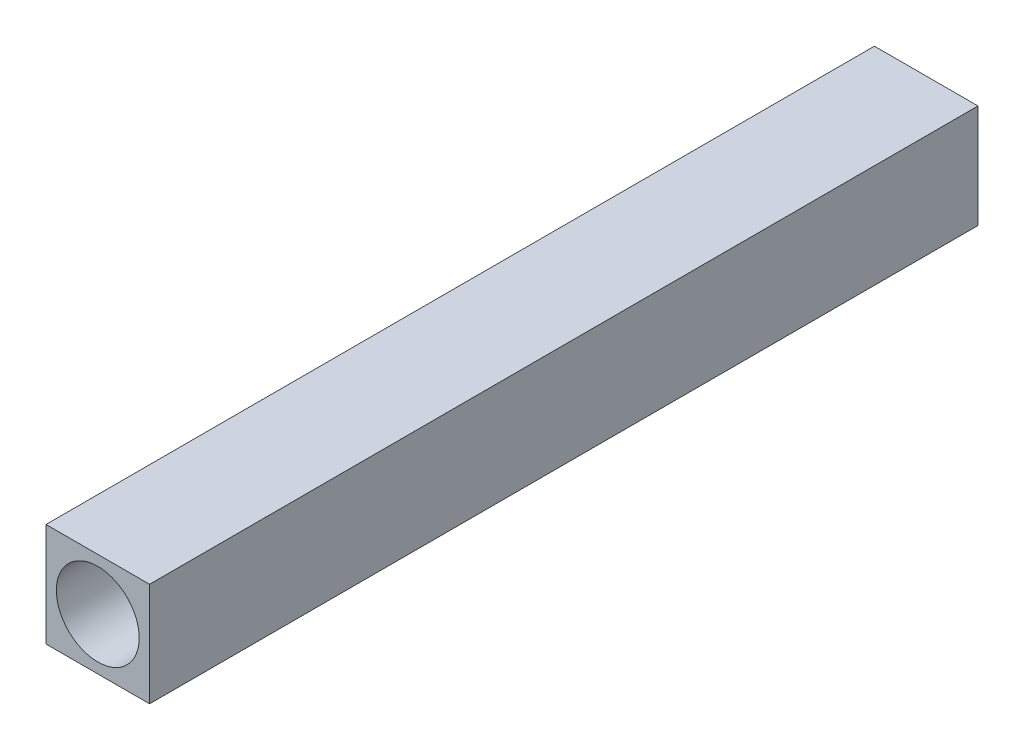
ISO-10303-21;
HEADER;
FILE_DESCRIPTION(('STEP AP214'),'2;1');
FILE_NAME('part.step','',(''),(''),'','','');
FILE_SCHEMA(('AUTOMOTIVE_DESIGN { 1 0 10303 214 1 1 1 1 }'));
ENDSEC;
DATA;
#1=APPLICATION_CONTEXT('core data for automotive mechanical design processes');
#2=APPLICATION_PROTOCOL_DEFINITION('international standard','automotive_design',2000,#1);
#3=PRODUCT_CONTEXT('',#1,'mechanical');
#4=PRODUCT('Part','Part','',(#3));
#5=PRODUCT_RELATED_PRODUCT_CATEGORY('part','',(#4));
#6=PRODUCT_DEFINITION_FORMATION('','',#4);
#7=PRODUCT_DEFINITION_CONTEXT('part definition',#1,'design');
#8=PRODUCT_DEFINITION('design','',#6,#7);
#9=PRODUCT_DEFINITION_SHAPE('','',#8);
#10=(LENGTH_UNIT() NAMED_UNIT(*) SI_UNIT(.MILLI.,.METRE.));
#11=(NAMED_UNIT(*) PLANE_ANGLE_UNIT() SI_UNIT($,.RADIAN.));
#12=(NAMED_UNIT(*) SI_UNIT($,.STERADIAN.) SOLID_ANGLE_UNIT());
#13=UNCERTAINTY_MEASURE_WITH_UNIT(LENGTH_MEASURE(1.E-05),#10,'distance_accuracy_value','');
#14=(GEOMETRIC_REPRESENTATION_CONTEXT(3) GLOBAL_UNCERTAINTY_ASSIGNED_CONTEXT((#13)) GLOBAL_UNIT_ASSIGNED_CONTEXT((#10,
#11,#12)) REPRESENTATION_CONTEXT('',''));
#15=CARTESIAN_POINT('',(0.,0.,0.));
#16=DIRECTION('',(0.,0.,1.));
#17=DIRECTION('',(1.,0.,0.));
#18=AXIS2_PLACEMENT_3D('',#15,#16,#17);
#19=CARTESIAN_POINT('',(0.,0.,100.));
#20=DIRECTION('',(0.,0.,-1.));
#21=DIRECTION('',(-1.,0.,0.));
#22=AXIS2_PLACEMENT_3D('',#19,#20,#21);
#23=PLANE('',#22);
#24=DIRECTION('',(0.,1.,0.));
#25=VECTOR('',#24,1.);
#26=CARTESIAN_POINT('',(12.5,-12.5,100.));
#27=LINE('',#26,#25);
#28=CARTESIAN_POINT('',(12.5,-12.5,100.));
#29=VERTEX_POINT('',#28);
#30=CARTESIAN_POINT('',(12.5,12.5,100.));
#31=VERTEX_POINT('',#30);
#32=EDGE_CURVE('E93',#29,#31,#27,.T.);
#33=ORIENTED_EDGE('',*,*,#32,.T.);
#34=DIRECTION('',(-1.,0.,0.));
#35=VECTOR('',#34,1.);
#36=CARTESIAN_POINT('',(-12.5,12.5,100.));
#37=LINE('',#36,#35);
#38=CARTESIAN_POINT('',(-12.5,12.5,100.));
#39=VERTEX_POINT('',#38);
#40=EDGE_CURVE('E87',#31,#39,#37,.T.);
#41=ORIENTED_EDGE('',*,*,#40,.T.);
#42=DIRECTION('',(0.,-1.,0.));
#43=VECTOR('',#42,1.);
#44=CARTESIAN_POINT('',(-12.5,-12.5,100.));
#45=LINE('',#44,#43);
#46=CARTESIAN_POINT('',(-12.5,-12.5,100.));
#47=VERTEX_POINT('',#46);
#48=EDGE_CURVE('E86',#39,#47,#45,.T.);
#49=ORIENTED_EDGE('',*,*,#48,.T.);
#50=DIRECTION('',(1.,0.,0.));
#51=VECTOR('',#50,1.);
#52=CARTESIAN_POINT('',(-12.5,-12.5,100.));
#53=LINE('',#52,#51);
#54=EDGE_CURVE('E57',#47,#29,#53,.T.);
#55=ORIENTED_EDGE('',*,*,#54,.T.);
#56=EDGE_LOOP('',(#33,#41,#49,#55));
#57=FACE_BOUND('',#56,.T.);
#58=CARTESIAN_POINT('',(0.,0.,100.));
#59=DIRECTION('',(0.,0.,1.));
#60=DIRECTION('',(1.,0.,0.));
#61=AXIS2_PLACEMENT_3D('',#58,#59,#60);
#62=CIRCLE('',#61,10.);
#63=CARTESIAN_POINT('',(10.,0.,100.));
#64=VERTEX_POINT('',#63);
#65=EDGE_CURVE('E108',#64,#64,#62,.T.);
#66=ORIENTED_EDGE('',*,*,#65,.F.);
#67=EDGE_LOOP('',(#66));
#68=FACE_BOUND('',#67,.T.);
#69=ADVANCED_FACE('F39',(#57,#68),#23,.F.);
#70=CARTESIAN_POINT('',(0.,0.,-100.));
#71=DIRECTION('',(0.,0.,-1.));
#72=DIRECTION('',(-1.,0.,0.));
#73=AXIS2_PLACEMENT_3D('',#70,#71,#72);
#74=PLANE('',#73);
#75=DIRECTION('',(0.,1.,0.));
#76=VECTOR('',#75,1.);
#77=CARTESIAN_POINT('',(12.5,-12.5,-100.));
#78=LINE('',#77,#76);
#79=CARTESIAN_POINT('',(12.5,-12.5,-100.));
#80=VERTEX_POINT('',#79);
#81=CARTESIAN_POINT('',(12.5,12.5,-100.));
#82=VERTEX_POINT('',#81);
#83=EDGE_CURVE('E105',#80,#82,#78,.T.);
#84=ORIENTED_EDGE('',*,*,#83,.F.);
#85=DIRECTION('',(1.,0.,0.));
#86=VECTOR('',#85,1.);
#87=CARTESIAN_POINT('',(-12.5,-12.5,-100.));
#88=LINE('',#87,#86);
#89=CARTESIAN_POINT('',(-12.5,-12.5,-100.));
#90=VERTEX_POINT('',#89);
#91=EDGE_CURVE('E76',#90,#80,#88,.T.);
#92=ORIENTED_EDGE('',*,*,#91,.F.);
#93=DIRECTION('',(0.,-1.,0.));
#94=VECTOR('',#93,1.);
#95=CARTESIAN_POINT('',(-12.5,-12.5,-100.));
#96=LINE('',#95,#94);
#97=CARTESIAN_POINT('',(-12.5,12.5,-100.));
#98=VERTEX_POINT('',#97);
#99=EDGE_CURVE('E73',#98,#90,#96,.T.);
#100=ORIENTED_EDGE('',*,*,#99,.F.);
#101=DIRECTION('',(-1.,0.,0.));
#102=VECTOR('',#101,1.);
#103=CARTESIAN_POINT('',(-12.5,12.5,-100.));
#104=LINE('',#103,#102);
#105=EDGE_CURVE('E91',#82,#98,#104,.T.);
#106=ORIENTED_EDGE('',*,*,#105,.F.);
#107=EDGE_LOOP('',(#84,#92,#100,#106));
#108=FACE_BOUND('',#107,.T.);
#109=CARTESIAN_POINT('',(0.,0.,-100.));
#110=DIRECTION('',(0.,0.,1.));
#111=DIRECTION('',(1.,0.,0.));
#112=AXIS2_PLACEMENT_3D('',#109,#110,#111);
#113=CIRCLE('',#112,10.);
#114=CARTESIAN_POINT('',(10.,0.,-100.));
#115=VERTEX_POINT('',#114);
#116=EDGE_CURVE('E118',#115,#115,#113,.T.);
#117=ORIENTED_EDGE('',*,*,#116,.T.);
#118=EDGE_LOOP('',(#117));
#119=FACE_BOUND('',#118,.T.);
#120=ADVANCED_FACE('F114',(#108,#119),#74,.T.);
#121=CARTESIAN_POINT('',(12.5,-12.5,100.));
#122=DIRECTION('',(-1.,0.,0.));
#123=DIRECTION('',(0.,0.,1.));
#124=AXIS2_PLACEMENT_3D('',#121,#122,#123);
#125=PLANE('',#124);
#126=ORIENTED_EDGE('',*,*,#83,.T.);
#127=DIRECTION('',(0.,0.,-1.));
#128=VECTOR('',#127,1.);
#129=CARTESIAN_POINT('',(12.5,12.5,100.));
#130=LINE('',#129,#128);
#131=EDGE_CURVE('E11',#31,#82,#130,.T.);
#132=ORIENTED_EDGE('',*,*,#131,.F.);
#133=ORIENTED_EDGE('',*,*,#32,.F.);
#134=DIRECTION('',(0.,0.,-1.));
#135=VECTOR('',#134,1.);
#136=CARTESIAN_POINT('',(12.5,-12.5,100.));
#137=LINE('',#136,#135);
#138=EDGE_CURVE('E99',#29,#80,#137,.T.);
#139=ORIENTED_EDGE('',*,*,#138,.T.);
#140=EDGE_LOOP('',(#126,#132,#133,#139));
#141=FACE_BOUND('',#140,.T.);
#142=ADVANCED_FACE('F41',(#141),#125,.F.);
#143=CARTESIAN_POINT('',(-12.5,12.5,100.));
#144=DIRECTION('',(0.,-1.,0.));
#145=DIRECTION('',(0.,0.,-1.));
#146=AXIS2_PLACEMENT_3D('',#143,#144,#145);
#147=PLANE('',#146);
#148=ORIENTED_EDGE('',*,*,#105,.T.);
#149=DIRECTION('',(0.,0.,-1.));
#150=VECTOR('',#149,1.);
#151=CARTESIAN_POINT('',(-12.5,12.5,100.));
#152=LINE('',#151,#150);
#153=EDGE_CURVE('E48',#39,#98,#152,.T.);
#154=ORIENTED_EDGE('',*,*,#153,.F.);
#155=ORIENTED_EDGE('',*,*,#40,.F.);
#156=ORIENTED_EDGE('',*,*,#131,.T.);
#157=EDGE_LOOP('',(#148,#154,#155,#156));
#158=FACE_BOUND('',#157,.T.);
#159=ADVANCED_FACE('F95',(#158),#147,.F.);
#160=CARTESIAN_POINT('',(-12.5,-12.5,100.));
#161=DIRECTION('',(1.,0.,0.));
#162=DIRECTION('',(0.,0.,-1.));
#163=AXIS2_PLACEMENT_3D('',#160,#161,#162);
#164=PLANE('',#163);
#165=ORIENTED_EDGE('',*,*,#99,.T.);
#166=DIRECTION('',(0.,0.,-1.));
#167=VECTOR('',#166,1.);
#168=CARTESIAN_POINT('',(-12.5,-12.5,100.));
#169=LINE('',#168,#167);
#170=EDGE_CURVE('E97',#47,#90,#169,.T.);
#171=ORIENTED_EDGE('',*,*,#170,.F.);
#172=ORIENTED_EDGE('',*,*,#48,.F.);
#173=ORIENTED_EDGE('',*,*,#153,.T.);
#174=EDGE_LOOP('',(#165,#171,#172,#173));
#175=FACE_BOUND('',#174,.T.);
#176=ADVANCED_FACE('F100',(#175),#164,.F.);
#177=CARTESIAN_POINT('',(-12.5,-12.5,100.));
#178=DIRECTION('',(0.,1.,0.));
#179=DIRECTION('',(0.,0.,1.));
#180=AXIS2_PLACEMENT_3D('',#177,#178,#179);
#181=PLANE('',#180);
#182=ORIENTED_EDGE('',*,*,#91,.T.);
#183=ORIENTED_EDGE('',*,*,#138,.F.);
#184=ORIENTED_EDGE('',*,*,#54,.F.);
#185=ORIENTED_EDGE('',*,*,#170,.T.);
#186=EDGE_LOOP('',(#182,#183,#184,#185));
#187=FACE_BOUND('',#186,.T.);
#188=ADVANCED_FACE('F113',(#187),#181,.F.);
#189=CARTESIAN_POINT('',(0.,0.,100.));
#190=DIRECTION('',(0.,0.,-1.));
#191=DIRECTION('',(-1.,0.,0.));
#192=AXIS2_PLACEMENT_3D('',#189,#190,#191);
#193=CYLINDRICAL_SURFACE('',#192,10.);
#194=ORIENTED_EDGE('',*,*,#65,.T.);
#195=EDGE_LOOP('',(#194));
#196=FACE_BOUND('',#195,.T.);
#197=ORIENTED_EDGE('',*,*,#116,.F.);
#198=EDGE_LOOP('',(#197));
#199=FACE_BOUND('',#198,.T.);
#200=ADVANCED_FACE('F122',(#196,#199),#193,.F.);
#201=CLOSED_SHELL('',(#69,#120,#142,#159,#176,#188,#200));
#202=MANIFOLD_SOLID_BREP('B2',#201);
#203=ADVANCED_BREP_SHAPE_REPRESENTATION('',(#18,#202),#14);
#204=SHAPE_DEFINITION_REPRESENTATION(#9,#203);
ENDSEC;
END-ISO-10303-21;
